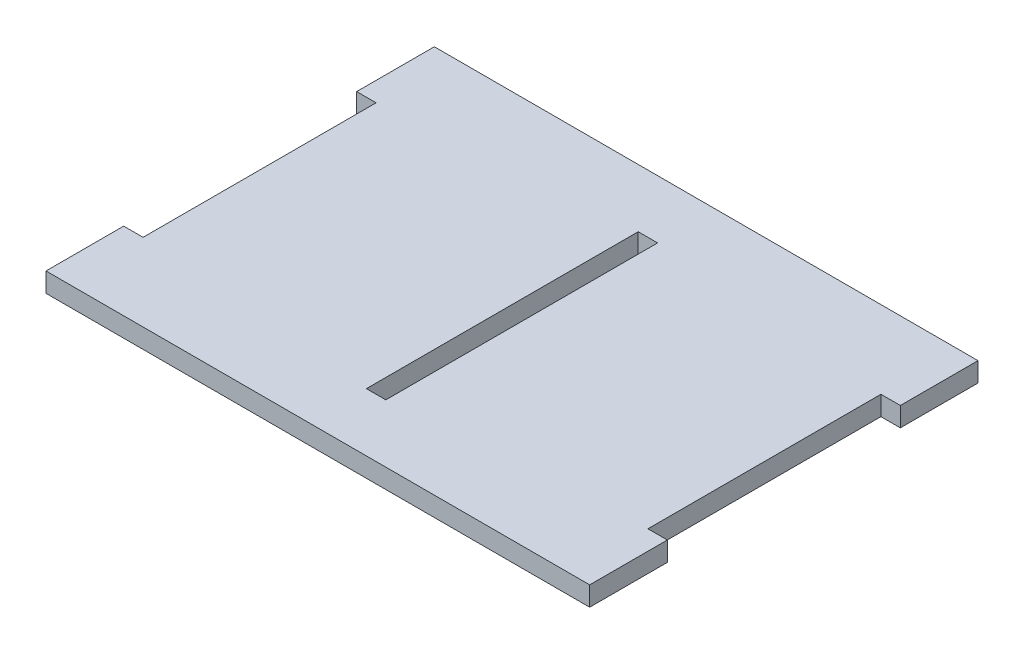
ISO-10303-21;
HEADER;
FILE_DESCRIPTION(('STEP AP214'),'2;1');
FILE_NAME('part.step','',(''),(''),'','','');
FILE_SCHEMA(('AUTOMOTIVE_DESIGN { 1 0 10303 214 1 1 1 1 }'));
ENDSEC;
DATA;
#1=APPLICATION_CONTEXT('core data for automotive mechanical design processes');
#2=APPLICATION_PROTOCOL_DEFINITION('international standard','automotive_design',2000,#1);
#3=PRODUCT_CONTEXT('',#1,'mechanical');
#4=PRODUCT('Part','Part','',(#3));
#5=PRODUCT_RELATED_PRODUCT_CATEGORY('part','',(#4));
#6=PRODUCT_DEFINITION_FORMATION('','',#4);
#7=PRODUCT_DEFINITION_CONTEXT('part definition',#1,'design');
#8=PRODUCT_DEFINITION('design','',#6,#7);
#9=PRODUCT_DEFINITION_SHAPE('','',#8);
#10=(LENGTH_UNIT() NAMED_UNIT(*) SI_UNIT(.MILLI.,.METRE.));
#11=(NAMED_UNIT(*) PLANE_ANGLE_UNIT() SI_UNIT($,.RADIAN.));
#12=(NAMED_UNIT(*) SI_UNIT($,.STERADIAN.) SOLID_ANGLE_UNIT());
#13=UNCERTAINTY_MEASURE_WITH_UNIT(LENGTH_MEASURE(1.E-05),#10,'distance_accuracy_value','');
#14=(GEOMETRIC_REPRESENTATION_CONTEXT(3) GLOBAL_UNCERTAINTY_ASSIGNED_CONTEXT((#13)) GLOBAL_UNIT_ASSIGNED_CONTEXT((#10,
#11,#12)) REPRESENTATION_CONTEXT('',''));
#15=CARTESIAN_POINT('',(0.,0.,0.));
#16=DIRECTION('',(0.,0.,1.));
#17=DIRECTION('',(1.,0.,0.));
#18=AXIS2_PLACEMENT_3D('',#15,#16,#17);
#19=CARTESIAN_POINT('',(44.4500000000001,3.175,-31.75));
#20=DIRECTION('',(-1.,0.,0.));
#21=DIRECTION('',(0.,0.,1.));
#22=AXIS2_PLACEMENT_3D('',#19,#20,#21);
#23=PLANE('',#22);
#24=DIRECTION('',(0.,0.,-1.));
#25=VECTOR('',#24,1.);
#26=CARTESIAN_POINT('',(44.4500000000001,0.,-31.75));
#27=LINE('',#26,#25);
#28=CARTESIAN_POINT('',(44.45,0.,-19.05));
#29=VERTEX_POINT('',#28);
#30=CARTESIAN_POINT('',(44.4500000000001,0.,-31.75));
#31=VERTEX_POINT('',#30);
#32=EDGE_CURVE('E179',#29,#31,#27,.T.);
#33=ORIENTED_EDGE('',*,*,#32,.T.);
#34=DIRECTION('',(0.,-1.,0.));
#35=VECTOR('',#34,1.);
#36=CARTESIAN_POINT('',(44.4500000000001,3.175,-31.75));
#37=LINE('',#36,#35);
#38=CARTESIAN_POINT('',(44.4500000000001,3.175,-31.75));
#39=VERTEX_POINT('',#38);
#40=EDGE_CURVE('E11',#39,#31,#37,.T.);
#41=ORIENTED_EDGE('',*,*,#40,.F.);
#42=DIRECTION('',(0.,0.,-1.));
#43=VECTOR('',#42,1.);
#44=CARTESIAN_POINT('',(44.4500000000001,3.175,-31.75));
#45=LINE('',#44,#43);
#46=CARTESIAN_POINT('',(44.45,3.175,-19.05));
#47=VERTEX_POINT('',#46);
#48=EDGE_CURVE('E183',#47,#39,#45,.T.);
#49=ORIENTED_EDGE('',*,*,#48,.F.);
#50=DIRECTION('',(0.,-1.,0.));
#51=VECTOR('',#50,1.);
#52=CARTESIAN_POINT('',(44.45,3.175,-19.05));
#53=LINE('',#52,#51);
#54=EDGE_CURVE('E209',#47,#29,#53,.T.);
#55=ORIENTED_EDGE('',*,*,#54,.T.);
#56=EDGE_LOOP('',(#33,#41,#49,#55));
#57=FACE_BOUND('',#56,.T.);
#58=ADVANCED_FACE('F34',(#57),#23,.F.);
#59=CARTESIAN_POINT('',(-41.275,3.175,-31.75));
#60=DIRECTION('',(0.,0.,1.));
#61=DIRECTION('',(1.,0.,0.));
#62=AXIS2_PLACEMENT_3D('',#59,#60,#61);
#63=PLANE('',#62);
#64=DIRECTION('',(-1.,0.,0.));
#65=VECTOR('',#64,1.);
#66=CARTESIAN_POINT('',(-41.275,0.,-31.75));
#67=LINE('',#66,#65);
#68=CARTESIAN_POINT('',(-44.45,0.,-31.75));
#69=VERTEX_POINT('',#68);
#70=EDGE_CURVE('E212',#31,#69,#67,.T.);
#71=ORIENTED_EDGE('',*,*,#70,.T.);
#72=DIRECTION('',(0.,-1.,0.));
#73=VECTOR('',#72,1.);
#74=CARTESIAN_POINT('',(-44.45,3.175,-31.75));
#75=LINE('',#74,#73);
#76=CARTESIAN_POINT('',(-44.45,3.175,-31.75));
#77=VERTEX_POINT('',#76);
#78=EDGE_CURVE('E41',#77,#69,#75,.T.);
#79=ORIENTED_EDGE('',*,*,#78,.F.);
#80=DIRECTION('',(-1.,0.,0.));
#81=VECTOR('',#80,1.);
#82=CARTESIAN_POINT('',(41.275,3.175,-31.75));
#83=LINE('',#82,#81);
#84=EDGE_CURVE('E186',#39,#77,#83,.T.);
#85=ORIENTED_EDGE('',*,*,#84,.F.);
#86=ORIENTED_EDGE('',*,*,#40,.T.);
#87=EDGE_LOOP('',(#71,#79,#85,#86));
#88=FACE_BOUND('',#87,.T.);
#89=ADVANCED_FACE('F288',(#88),#63,.F.);
#90=CARTESIAN_POINT('',(-44.45,3.175,-31.75));
#91=DIRECTION('',(1.,0.,0.));
#92=DIRECTION('',(0.,0.,-1.));
#93=AXIS2_PLACEMENT_3D('',#90,#91,#92);
#94=PLANE('',#93);
#95=DIRECTION('',(0.,0.,1.));
#96=VECTOR('',#95,1.);
#97=CARTESIAN_POINT('',(-44.45,0.,-31.75));
#98=LINE('',#97,#96);
#99=CARTESIAN_POINT('',(-44.45,0.,-19.05));
#100=VERTEX_POINT('',#99);
#101=EDGE_CURVE('E214',#69,#100,#98,.T.);
#102=ORIENTED_EDGE('',*,*,#101,.T.);
#103=DIRECTION('',(0.,-1.,0.));
#104=VECTOR('',#103,1.);
#105=CARTESIAN_POINT('',(-44.45,3.175,-19.05));
#106=LINE('',#105,#104);
#107=CARTESIAN_POINT('',(-44.45,3.175,-19.05));
#108=VERTEX_POINT('',#107);
#109=EDGE_CURVE('E260',#108,#100,#106,.T.);
#110=ORIENTED_EDGE('',*,*,#109,.F.);
#111=DIRECTION('',(0.,0.,1.));
#112=VECTOR('',#111,1.);
#113=CARTESIAN_POINT('',(-44.45,3.175,-31.75));
#114=LINE('',#113,#112);
#115=EDGE_CURVE('E189',#77,#108,#114,.T.);
#116=ORIENTED_EDGE('',*,*,#115,.F.);
#117=ORIENTED_EDGE('',*,*,#78,.T.);
#118=EDGE_LOOP('',(#102,#110,#116,#117));
#119=FACE_BOUND('',#118,.T.);
#120=ADVANCED_FACE('F267',(#119),#94,.F.);
#121=CARTESIAN_POINT('',(-44.45,3.175,-19.05));
#122=DIRECTION('',(0.,0.,-1.));
#123=DIRECTION('',(-1.,0.,0.));
#124=AXIS2_PLACEMENT_3D('',#121,#122,#123);
#125=PLANE('',#124);
#126=DIRECTION('',(1.,0.,0.));
#127=VECTOR('',#126,1.);
#128=CARTESIAN_POINT('',(-44.45,0.,-19.05));
#129=LINE('',#128,#127);
#130=CARTESIAN_POINT('',(-41.275,0.,-19.05));
#131=VERTEX_POINT('',#130);
#132=EDGE_CURVE('E216',#100,#131,#129,.T.);
#133=ORIENTED_EDGE('',*,*,#132,.T.);
#134=DIRECTION('',(0.,-1.,0.));
#135=VECTOR('',#134,1.);
#136=CARTESIAN_POINT('',(-41.275,3.175,-19.05));
#137=LINE('',#136,#135);
#138=CARTESIAN_POINT('',(-41.275,3.175,-19.05));
#139=VERTEX_POINT('',#138);
#140=EDGE_CURVE('E257',#139,#131,#137,.T.);
#141=ORIENTED_EDGE('',*,*,#140,.F.);
#142=DIRECTION('',(1.,0.,0.));
#143=VECTOR('',#142,1.);
#144=CARTESIAN_POINT('',(-44.45,3.175,-19.05));
#145=LINE('',#144,#143);
#146=EDGE_CURVE('E191',#108,#139,#145,.T.);
#147=ORIENTED_EDGE('',*,*,#146,.F.);
#148=ORIENTED_EDGE('',*,*,#109,.T.);
#149=EDGE_LOOP('',(#133,#141,#147,#148));
#150=FACE_BOUND('',#149,.T.);
#151=ADVANCED_FACE('F276',(#150),#125,.F.);
#152=CARTESIAN_POINT('',(-41.275,3.175,19.05));
#153=DIRECTION('',(1.,0.,0.));
#154=DIRECTION('',(0.,0.,-1.));
#155=AXIS2_PLACEMENT_3D('',#152,#153,#154);
#156=PLANE('',#155);
#157=DIRECTION('',(0.,0.,1.));
#158=VECTOR('',#157,1.);
#159=CARTESIAN_POINT('',(-41.275,0.,19.05));
#160=LINE('',#159,#158);
#161=CARTESIAN_POINT('',(-41.275,0.,19.05));
#162=VERTEX_POINT('',#161);
#163=EDGE_CURVE('E218',#131,#162,#160,.T.);
#164=ORIENTED_EDGE('',*,*,#163,.T.);
#165=DIRECTION('',(0.,-1.,0.));
#166=VECTOR('',#165,1.);
#167=CARTESIAN_POINT('',(-41.275,3.175,19.05));
#168=LINE('',#167,#166);
#169=CARTESIAN_POINT('',(-41.275,3.175,19.05));
#170=VERTEX_POINT('',#169);
#171=EDGE_CURVE('E254',#170,#162,#168,.T.);
#172=ORIENTED_EDGE('',*,*,#171,.F.);
#173=DIRECTION('',(0.,0.,1.));
#174=VECTOR('',#173,1.);
#175=CARTESIAN_POINT('',(-41.275,3.175,19.05));
#176=LINE('',#175,#174);
#177=EDGE_CURVE('E193',#139,#170,#176,.T.);
#178=ORIENTED_EDGE('',*,*,#177,.F.);
#179=ORIENTED_EDGE('',*,*,#140,.T.);
#180=EDGE_LOOP('',(#164,#172,#178,#179));
#181=FACE_BOUND('',#180,.T.);
#182=ADVANCED_FACE('F280',(#181),#156,.F.);
#183=CARTESIAN_POINT('',(-44.45,3.175,19.05));
#184=DIRECTION('',(0.,0.,1.));
#185=DIRECTION('',(1.,0.,0.));
#186=AXIS2_PLACEMENT_3D('',#183,#184,#185);
#187=PLANE('',#186);
#188=DIRECTION('',(-1.,0.,0.));
#189=VECTOR('',#188,1.);
#190=CARTESIAN_POINT('',(-44.45,0.,19.05));
#191=LINE('',#190,#189);
#192=CARTESIAN_POINT('',(-44.45,0.,19.05));
#193=VERTEX_POINT('',#192);
#194=EDGE_CURVE('E220',#162,#193,#191,.T.);
#195=ORIENTED_EDGE('',*,*,#194,.T.);
#196=DIRECTION('',(0.,-1.,0.));
#197=VECTOR('',#196,1.);
#198=CARTESIAN_POINT('',(-44.45,3.175,19.05));
#199=LINE('',#198,#197);
#200=CARTESIAN_POINT('',(-44.45,3.175,19.05));
#201=VERTEX_POINT('',#200);
#202=EDGE_CURVE('E251',#201,#193,#199,.T.);
#203=ORIENTED_EDGE('',*,*,#202,.F.);
#204=DIRECTION('',(-1.,0.,0.));
#205=VECTOR('',#204,1.);
#206=CARTESIAN_POINT('',(-44.45,3.175,19.05));
#207=LINE('',#206,#205);
#208=EDGE_CURVE('E195',#170,#201,#207,.T.);
#209=ORIENTED_EDGE('',*,*,#208,.F.);
#210=ORIENTED_EDGE('',*,*,#171,.T.);
#211=EDGE_LOOP('',(#195,#203,#209,#210));
#212=FACE_BOUND('',#211,.T.);
#213=ADVANCED_FACE('F320',(#212),#187,.F.);
#214=CARTESIAN_POINT('',(-44.45,3.175,31.75));
#215=DIRECTION('',(1.,0.,0.));
#216=DIRECTION('',(0.,0.,-1.));
#217=AXIS2_PLACEMENT_3D('',#214,#215,#216);
#218=PLANE('',#217);
#219=DIRECTION('',(0.,0.,1.));
#220=VECTOR('',#219,1.);
#221=CARTESIAN_POINT('',(-44.45,0.,31.75));
#222=LINE('',#221,#220);
#223=CARTESIAN_POINT('',(-44.45,0.,31.75));
#224=VERTEX_POINT('',#223);
#225=EDGE_CURVE('E222',#193,#224,#222,.T.);
#226=ORIENTED_EDGE('',*,*,#225,.T.);
#227=DIRECTION('',(0.,-1.,0.));
#228=VECTOR('',#227,1.);
#229=CARTESIAN_POINT('',(-44.45,3.175,31.75));
#230=LINE('',#229,#228);
#231=CARTESIAN_POINT('',(-44.45,3.175,31.75));
#232=VERTEX_POINT('',#231);
#233=EDGE_CURVE('E248',#232,#224,#230,.T.);
#234=ORIENTED_EDGE('',*,*,#233,.F.);
#235=DIRECTION('',(0.,0.,1.));
#236=VECTOR('',#235,1.);
#237=CARTESIAN_POINT('',(-44.45,3.175,31.75));
#238=LINE('',#237,#236);
#239=EDGE_CURVE('E197',#201,#232,#238,.T.);
#240=ORIENTED_EDGE('',*,*,#239,.F.);
#241=ORIENTED_EDGE('',*,*,#202,.T.);
#242=EDGE_LOOP('',(#226,#234,#240,#241));
#243=FACE_BOUND('',#242,.T.);
#244=ADVANCED_FACE('F318',(#243),#218,.F.);
#245=CARTESIAN_POINT('',(41.275,3.175,31.75));
#246=DIRECTION('',(0.,0.,-1.));
#247=DIRECTION('',(-1.,0.,0.));
#248=AXIS2_PLACEMENT_3D('',#245,#246,#247);
#249=PLANE('',#248);
#250=DIRECTION('',(1.,0.,0.));
#251=VECTOR('',#250,1.);
#252=CARTESIAN_POINT('',(41.275,0.,31.75));
#253=LINE('',#252,#251);
#254=CARTESIAN_POINT('',(44.45,0.,31.75));
#255=VERTEX_POINT('',#254);
#256=EDGE_CURVE('E225',#224,#255,#253,.T.);
#257=ORIENTED_EDGE('',*,*,#256,.T.);
#258=DIRECTION('',(0.,-1.,0.));
#259=VECTOR('',#258,1.);
#260=CARTESIAN_POINT('',(44.45,3.175,31.75));
#261=LINE('',#260,#259);
#262=CARTESIAN_POINT('',(44.45,3.175,31.75));
#263=VERTEX_POINT('',#262);
#264=EDGE_CURVE('E245',#263,#255,#261,.T.);
#265=ORIENTED_EDGE('',*,*,#264,.F.);
#266=DIRECTION('',(1.,0.,0.));
#267=VECTOR('',#266,1.);
#268=CARTESIAN_POINT('',(-41.275,3.175,31.75));
#269=LINE('',#268,#267);
#270=EDGE_CURVE('E199',#232,#263,#269,.T.);
#271=ORIENTED_EDGE('',*,*,#270,.F.);
#272=ORIENTED_EDGE('',*,*,#233,.T.);
#273=EDGE_LOOP('',(#257,#265,#271,#272));
#274=FACE_BOUND('',#273,.T.);
#275=ADVANCED_FACE('F314',(#274),#249,.F.);
#276=CARTESIAN_POINT('',(44.45,3.175,31.75));
#277=DIRECTION('',(-1.,0.,0.));
#278=DIRECTION('',(0.,0.,1.));
#279=AXIS2_PLACEMENT_3D('',#276,#277,#278);
#280=PLANE('',#279);
#281=DIRECTION('',(0.,0.,-1.));
#282=VECTOR('',#281,1.);
#283=CARTESIAN_POINT('',(44.45,0.,31.75));
#284=LINE('',#283,#282);
#285=CARTESIAN_POINT('',(44.45,0.,19.05));
#286=VERTEX_POINT('',#285);
#287=EDGE_CURVE('E227',#255,#286,#284,.T.);
#288=ORIENTED_EDGE('',*,*,#287,.T.);
#289=DIRECTION('',(0.,-1.,0.));
#290=VECTOR('',#289,1.);
#291=CARTESIAN_POINT('',(44.45,3.175,19.05));
#292=LINE('',#291,#290);
#293=CARTESIAN_POINT('',(44.45,3.175,19.05));
#294=VERTEX_POINT('',#293);
#295=EDGE_CURVE('E242',#294,#286,#292,.T.);
#296=ORIENTED_EDGE('',*,*,#295,.F.);
#297=DIRECTION('',(0.,0.,-1.));
#298=VECTOR('',#297,1.);
#299=CARTESIAN_POINT('',(44.45,3.175,31.75));
#300=LINE('',#299,#298);
#301=EDGE_CURVE('E201',#263,#294,#300,.T.);
#302=ORIENTED_EDGE('',*,*,#301,.F.);
#303=ORIENTED_EDGE('',*,*,#264,.T.);
#304=EDGE_LOOP('',(#288,#296,#302,#303));
#305=FACE_BOUND('',#304,.T.);
#306=ADVANCED_FACE('F309',(#305),#280,.F.);
#307=CARTESIAN_POINT('',(44.45,3.175,19.05));
#308=DIRECTION('',(0.,0.,1.));
#309=DIRECTION('',(1.,0.,0.));
#310=AXIS2_PLACEMENT_3D('',#307,#308,#309);
#311=PLANE('',#310);
#312=DIRECTION('',(-1.,0.,0.));
#313=VECTOR('',#312,1.);
#314=CARTESIAN_POINT('',(44.45,0.,19.05));
#315=LINE('',#314,#313);
#316=CARTESIAN_POINT('',(41.275,0.,19.05));
#317=VERTEX_POINT('',#316);
#318=EDGE_CURVE('E229',#286,#317,#315,.T.);
#319=ORIENTED_EDGE('',*,*,#318,.T.);
#320=DIRECTION('',(0.,-1.,0.));
#321=VECTOR('',#320,1.);
#322=CARTESIAN_POINT('',(41.275,3.175,19.05));
#323=LINE('',#322,#321);
#324=CARTESIAN_POINT('',(41.275,3.175,19.05));
#325=VERTEX_POINT('',#324);
#326=EDGE_CURVE('E239',#325,#317,#323,.T.);
#327=ORIENTED_EDGE('',*,*,#326,.F.);
#328=DIRECTION('',(-1.,0.,0.));
#329=VECTOR('',#328,1.);
#330=CARTESIAN_POINT('',(44.45,3.175,19.05));
#331=LINE('',#330,#329);
#332=EDGE_CURVE('E203',#294,#325,#331,.T.);
#333=ORIENTED_EDGE('',*,*,#332,.F.);
#334=ORIENTED_EDGE('',*,*,#295,.T.);
#335=EDGE_LOOP('',(#319,#327,#333,#334));
#336=FACE_BOUND('',#335,.T.);
#337=ADVANCED_FACE('F304',(#336),#311,.F.);
#338=CARTESIAN_POINT('',(41.275,3.175,19.05));
#339=DIRECTION('',(-1.,0.,0.));
#340=DIRECTION('',(0.,0.,1.));
#341=AXIS2_PLACEMENT_3D('',#338,#339,#340);
#342=PLANE('',#341);
#343=DIRECTION('',(0.,0.,-1.));
#344=VECTOR('',#343,1.);
#345=CARTESIAN_POINT('',(41.275,0.,19.05));
#346=LINE('',#345,#344);
#347=CARTESIAN_POINT('',(41.275,0.,-19.05));
#348=VERTEX_POINT('',#347);
#349=EDGE_CURVE('E231',#317,#348,#346,.T.);
#350=ORIENTED_EDGE('',*,*,#349,.T.);
#351=DIRECTION('',(0.,-1.,0.));
#352=VECTOR('',#351,1.);
#353=CARTESIAN_POINT('',(41.275,3.175,-19.05));
#354=LINE('',#353,#352);
#355=CARTESIAN_POINT('',(41.275,3.175,-19.05));
#356=VERTEX_POINT('',#355);
#357=EDGE_CURVE('E236',#356,#348,#354,.T.);
#358=ORIENTED_EDGE('',*,*,#357,.F.);
#359=DIRECTION('',(0.,0.,-1.));
#360=VECTOR('',#359,1.);
#361=CARTESIAN_POINT('',(41.275,3.175,19.05));
#362=LINE('',#361,#360);
#363=EDGE_CURVE('E205',#325,#356,#362,.T.);
#364=ORIENTED_EDGE('',*,*,#363,.F.);
#365=ORIENTED_EDGE('',*,*,#326,.T.);
#366=EDGE_LOOP('',(#350,#358,#364,#365));
#367=FACE_BOUND('',#366,.T.);
#368=ADVANCED_FACE('F300',(#367),#342,.F.);
#369=CARTESIAN_POINT('',(44.45,3.175,-19.05));
#370=DIRECTION('',(0.,0.,-1.));
#371=DIRECTION('',(-1.,0.,0.));
#372=AXIS2_PLACEMENT_3D('',#369,#370,#371);
#373=PLANE('',#372);
#374=DIRECTION('',(1.,0.,0.));
#375=VECTOR('',#374,1.);
#376=CARTESIAN_POINT('',(44.45,0.,-19.05));
#377=LINE('',#376,#375);
#378=EDGE_CURVE('E187',#348,#29,#377,.T.);
#379=ORIENTED_EDGE('',*,*,#378,.T.);
#380=ORIENTED_EDGE('',*,*,#54,.F.);
#381=DIRECTION('',(1.,0.,0.));
#382=VECTOR('',#381,1.);
#383=CARTESIAN_POINT('',(44.45,3.175,-19.05));
#384=LINE('',#383,#382);
#385=EDGE_CURVE('E207',#356,#47,#384,.T.);
#386=ORIENTED_EDGE('',*,*,#385,.F.);
#387=ORIENTED_EDGE('',*,*,#357,.T.);
#388=EDGE_LOOP('',(#379,#380,#386,#387));
#389=FACE_BOUND('',#388,.T.);
#390=ADVANCED_FACE('F295',(#389),#373,.F.);
#391=CARTESIAN_POINT('',(0.,3.175,0.));
#392=DIRECTION('',(0.,-1.,0.));
#393=DIRECTION('',(0.,0.,-1.));
#394=AXIS2_PLACEMENT_3D('',#391,#392,#393);
#395=PLANE('',#394);
#396=DIRECTION('',(1.,0.,0.));
#397=VECTOR('',#396,1.);
#398=CARTESIAN_POINT('',(-1.58750000000001,3.175,22.225));
#399=LINE('',#398,#397);
#400=CARTESIAN_POINT('',(-1.58750000000001,3.175,22.225));
#401=VERTEX_POINT('',#400);
#402=CARTESIAN_POINT('',(1.58749999999999,3.175,22.225));
#403=VERTEX_POINT('',#402);
#404=EDGE_CURVE('E173',#401,#403,#399,.T.);
#405=ORIENTED_EDGE('',*,*,#404,.F.);
#406=DIRECTION('',(0.,0.,1.));
#407=VECTOR('',#406,1.);
#408=CARTESIAN_POINT('',(-1.58750000000001,3.175,-22.225));
#409=LINE('',#408,#407);
#410=CARTESIAN_POINT('',(-1.58750000000001,3.175,-22.225));
#411=VERTEX_POINT('',#410);
#412=EDGE_CURVE('E48',#411,#401,#409,.T.);
#413=ORIENTED_EDGE('',*,*,#412,.F.);
#414=DIRECTION('',(-1.,0.,0.));
#415=VECTOR('',#414,1.);
#416=CARTESIAN_POINT('',(-1.58750000000001,3.175,-22.225));
#417=LINE('',#416,#415);
#418=CARTESIAN_POINT('',(1.58749999999998,3.175,-22.225));
#419=VERTEX_POINT('',#418);
#420=EDGE_CURVE('E164',#419,#411,#417,.T.);
#421=ORIENTED_EDGE('',*,*,#420,.F.);
#422=DIRECTION('',(0.,0.,-1.));
#423=VECTOR('',#422,1.);
#424=CARTESIAN_POINT('',(1.58749999999998,3.175,-22.225));
#425=LINE('',#424,#423);
#426=EDGE_CURVE('E167',#403,#419,#425,.T.);
#427=ORIENTED_EDGE('',*,*,#426,.F.);
#428=EDGE_LOOP('',(#405,#413,#421,#427));
#429=FACE_BOUND('',#428,.T.);
#430=ORIENTED_EDGE('',*,*,#48,.T.);
#431=ORIENTED_EDGE('',*,*,#84,.T.);
#432=ORIENTED_EDGE('',*,*,#115,.T.);
#433=ORIENTED_EDGE('',*,*,#146,.T.);
#434=ORIENTED_EDGE('',*,*,#177,.T.);
#435=ORIENTED_EDGE('',*,*,#208,.T.);
#436=ORIENTED_EDGE('',*,*,#239,.T.);
#437=ORIENTED_EDGE('',*,*,#270,.T.);
#438=ORIENTED_EDGE('',*,*,#301,.T.);
#439=ORIENTED_EDGE('',*,*,#332,.T.);
#440=ORIENTED_EDGE('',*,*,#363,.T.);
#441=ORIENTED_EDGE('',*,*,#385,.T.);
#442=EDGE_LOOP('',(#430,#431,#432,#433,#434,#435,#436,#437,#438,#439,#440,#441));
#443=FACE_BOUND('',#442,.T.);
#444=ADVANCED_FACE('F284',(#429,#443),#395,.F.);
#445=CARTESIAN_POINT('',(0.,0.,0.));
#446=DIRECTION('',(0.,-1.,0.));
#447=DIRECTION('',(0.,0.,-1.));
#448=AXIS2_PLACEMENT_3D('',#445,#446,#447);
#449=PLANE('',#448);
#450=DIRECTION('',(0.,0.,1.));
#451=VECTOR('',#450,1.);
#452=CARTESIAN_POINT('',(-1.58750000000001,0.,-22.225));
#453=LINE('',#452,#451);
#454=CARTESIAN_POINT('',(-1.58750000000001,0.,-22.225));
#455=VERTEX_POINT('',#454);
#456=CARTESIAN_POINT('',(-1.58750000000001,0.,22.225));
#457=VERTEX_POINT('',#456);
#458=EDGE_CURVE('E148',#455,#457,#453,.T.);
#459=ORIENTED_EDGE('',*,*,#458,.T.);
#460=DIRECTION('',(1.,0.,0.));
#461=VECTOR('',#460,1.);
#462=CARTESIAN_POINT('',(-1.58750000000001,0.,22.225));
#463=LINE('',#462,#461);
#464=CARTESIAN_POINT('',(1.58749999999999,0.,22.225));
#465=VERTEX_POINT('',#464);
#466=EDGE_CURVE('E157',#457,#465,#463,.T.);
#467=ORIENTED_EDGE('',*,*,#466,.T.);
#468=DIRECTION('',(0.,0.,-1.));
#469=VECTOR('',#468,1.);
#470=CARTESIAN_POINT('',(1.58749999999998,0.,-22.225));
#471=LINE('',#470,#469);
#472=CARTESIAN_POINT('',(1.58749999999998,0.,-22.225));
#473=VERTEX_POINT('',#472);
#474=EDGE_CURVE('E56',#465,#473,#471,.T.);
#475=ORIENTED_EDGE('',*,*,#474,.T.);
#476=DIRECTION('',(-1.,0.,0.));
#477=VECTOR('',#476,1.);
#478=CARTESIAN_POINT('',(-1.58750000000001,0.,-22.225));
#479=LINE('',#478,#477);
#480=EDGE_CURVE('E154',#473,#455,#479,.T.);
#481=ORIENTED_EDGE('',*,*,#480,.T.);
#482=EDGE_LOOP('',(#459,#467,#475,#481));
#483=FACE_BOUND('',#482,.T.);
#484=ORIENTED_EDGE('',*,*,#32,.F.);
#485=ORIENTED_EDGE('',*,*,#378,.F.);
#486=ORIENTED_EDGE('',*,*,#349,.F.);
#487=ORIENTED_EDGE('',*,*,#318,.F.);
#488=ORIENTED_EDGE('',*,*,#287,.F.);
#489=ORIENTED_EDGE('',*,*,#256,.F.);
#490=ORIENTED_EDGE('',*,*,#225,.F.);
#491=ORIENTED_EDGE('',*,*,#194,.F.);
#492=ORIENTED_EDGE('',*,*,#163,.F.);
#493=ORIENTED_EDGE('',*,*,#132,.F.);
#494=ORIENTED_EDGE('',*,*,#101,.F.);
#495=ORIENTED_EDGE('',*,*,#70,.F.);
#496=EDGE_LOOP('',(#484,#485,#486,#487,#488,#489,#490,#491,#492,#493,#494,#495));
#497=FACE_BOUND('',#496,.T.);
#498=ADVANCED_FACE('F161',(#483,#497),#449,.T.);
#499=CARTESIAN_POINT('',(-1.58750000000001,0.,-22.225));
#500=DIRECTION('',(-1.,0.,0.));
#501=DIRECTION('',(0.,0.,1.));
#502=AXIS2_PLACEMENT_3D('',#499,#500,#501);
#503=PLANE('',#502);
#504=ORIENTED_EDGE('',*,*,#412,.T.);
#505=DIRECTION('',(0.,1.,0.));
#506=VECTOR('',#505,1.);
#507=CARTESIAN_POINT('',(-1.58750000000001,0.,22.225));
#508=LINE('',#507,#506);
#509=EDGE_CURVE('E144',#457,#401,#508,.T.);
#510=ORIENTED_EDGE('',*,*,#509,.F.);
#511=ORIENTED_EDGE('',*,*,#458,.F.);
#512=DIRECTION('',(0.,1.,0.));
#513=VECTOR('',#512,1.);
#514=CARTESIAN_POINT('',(-1.58750000000001,0.,-22.225));
#515=LINE('',#514,#513);
#516=EDGE_CURVE('E177',#455,#411,#515,.T.);
#517=ORIENTED_EDGE('',*,*,#516,.T.);
#518=EDGE_LOOP('',(#504,#510,#511,#517));
#519=FACE_BOUND('',#518,.T.);
#520=ADVANCED_FACE('F146',(#519),#503,.F.);
#521=CARTESIAN_POINT('',(-1.58750000000001,0.,-22.225));
#522=DIRECTION('',(0.,0.,-1.));
#523=DIRECTION('',(-1.,0.,0.));
#524=AXIS2_PLACEMENT_3D('',#521,#522,#523);
#525=PLANE('',#524);
#526=ORIENTED_EDGE('',*,*,#420,.T.);
#527=ORIENTED_EDGE('',*,*,#516,.F.);
#528=ORIENTED_EDGE('',*,*,#480,.F.);
#529=DIRECTION('',(0.,1.,0.));
#530=VECTOR('',#529,1.);
#531=CARTESIAN_POINT('',(1.58749999999998,0.,-22.225));
#532=LINE('',#531,#530);
#533=EDGE_CURVE('E180',#473,#419,#532,.T.);
#534=ORIENTED_EDGE('',*,*,#533,.T.);
#535=EDGE_LOOP('',(#526,#527,#528,#534));
#536=FACE_BOUND('',#535,.T.);
#537=ADVANCED_FACE('F425',(#536),#525,.F.);
#538=CARTESIAN_POINT('',(1.58749999999998,0.,-22.225));
#539=DIRECTION('',(1.,0.,0.));
#540=DIRECTION('',(0.,0.,-1.));
#541=AXIS2_PLACEMENT_3D('',#538,#539,#540);
#542=PLANE('',#541);
#543=ORIENTED_EDGE('',*,*,#426,.T.);
#544=ORIENTED_EDGE('',*,*,#533,.F.);
#545=ORIENTED_EDGE('',*,*,#474,.F.);
#546=DIRECTION('',(0.,1.,0.));
#547=VECTOR('',#546,1.);
#548=CARTESIAN_POINT('',(1.58749999999999,0.,22.225));
#549=LINE('',#548,#547);
#550=EDGE_CURVE('E153',#465,#403,#549,.T.);
#551=ORIENTED_EDGE('',*,*,#550,.T.);
#552=EDGE_LOOP('',(#543,#544,#545,#551));
#553=FACE_BOUND('',#552,.T.);
#554=ADVANCED_FACE('F434',(#553),#542,.F.);
#555=CARTESIAN_POINT('',(-1.58750000000001,0.,22.225));
#556=DIRECTION('',(0.,0.,1.));
#557=DIRECTION('',(1.,0.,0.));
#558=AXIS2_PLACEMENT_3D('',#555,#556,#557);
#559=PLANE('',#558);
#560=ORIENTED_EDGE('',*,*,#404,.T.);
#561=ORIENTED_EDGE('',*,*,#550,.F.);
#562=ORIENTED_EDGE('',*,*,#466,.F.);
#563=ORIENTED_EDGE('',*,*,#509,.T.);
#564=EDGE_LOOP('',(#560,#561,#562,#563));
#565=FACE_BOUND('',#564,.T.);
#566=ADVANCED_FACE('F158',(#565),#559,.F.);
#567=CLOSED_SHELL('',(#58,#89,#120,#151,#182,#213,#244,#275,#306,#337,#368,#390,#444,#498,#520,
#537,#554,#566));
#568=MANIFOLD_SOLID_BREP('B2',#567);
#569=ADVANCED_BREP_SHAPE_REPRESENTATION('',(#18,#568),#14);
#570=SHAPE_DEFINITION_REPRESENTATION(#9,#569);
ENDSEC;
END-ISO-10303-21;
